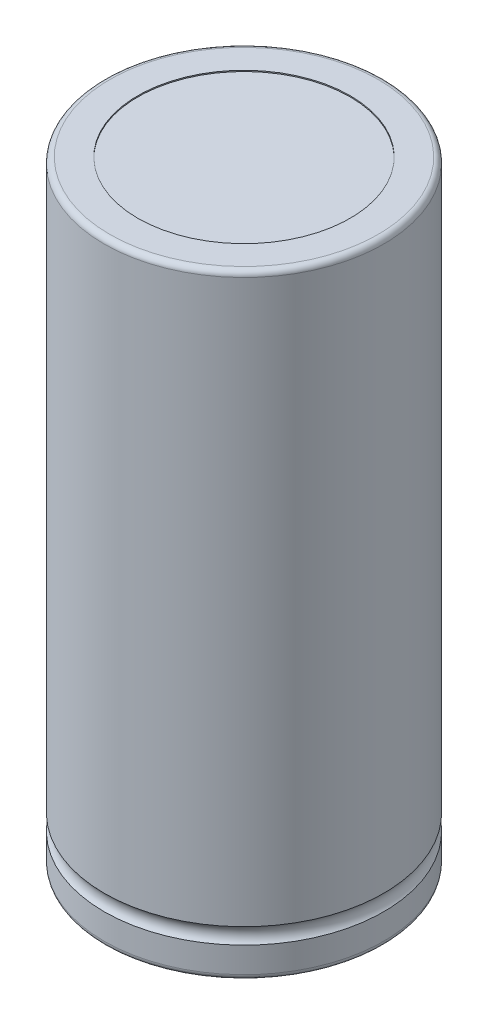
ISO-10303-21;
HEADER;
FILE_DESCRIPTION(('STEP AP214'),'2;1');
FILE_NAME('part.step','',(''),(''),'','','');
FILE_SCHEMA(('AUTOMOTIVE_DESIGN { 1 0 10303 214 1 1 1 1 }'));
ENDSEC;
DATA;
#1=APPLICATION_CONTEXT('core data for automotive mechanical design processes');
#2=APPLICATION_PROTOCOL_DEFINITION('international standard','automotive_design',2000,#1);
#3=PRODUCT_CONTEXT('',#1,'mechanical');
#4=PRODUCT('Part','Part','',(#3));
#5=PRODUCT_RELATED_PRODUCT_CATEGORY('part','',(#4));
#6=PRODUCT_DEFINITION_FORMATION('','',#4);
#7=PRODUCT_DEFINITION_CONTEXT('part definition',#1,'design');
#8=PRODUCT_DEFINITION('design','',#6,#7);
#9=PRODUCT_DEFINITION_SHAPE('','',#8);
#10=(LENGTH_UNIT() NAMED_UNIT(*) SI_UNIT(.MILLI.,.METRE.));
#11=(NAMED_UNIT(*) PLANE_ANGLE_UNIT() SI_UNIT($,.RADIAN.));
#12=(NAMED_UNIT(*) SI_UNIT($,.STERADIAN.) SOLID_ANGLE_UNIT());
#13=UNCERTAINTY_MEASURE_WITH_UNIT(LENGTH_MEASURE(1.E-05),#10,'distance_accuracy_value','');
#14=(GEOMETRIC_REPRESENTATION_CONTEXT(3) GLOBAL_UNCERTAINTY_ASSIGNED_CONTEXT((#13)) GLOBAL_UNIT_ASSIGNED_CONTEXT((#10,
#11,#12)) REPRESENTATION_CONTEXT('',''));
#15=CARTESIAN_POINT('',(0.,0.,0.));
#16=DIRECTION('',(0.,0.,1.));
#17=DIRECTION('',(1.,0.,0.));
#18=AXIS2_PLACEMENT_3D('',#15,#16,#17);
#19=CARTESIAN_POINT('',(5.,-3.9,0.));
#20=DIRECTION('',(0.,-1.,0.));
#21=DIRECTION('',(0.,0.,-1.));
#22=AXIS2_PLACEMENT_3D('',#19,#20,#21);
#23=PLANE('',#22);
#24=CARTESIAN_POINT('',(5.,-3.9,0.));
#25=DIRECTION('',(0.,1.,0.));
#26=DIRECTION('',(0.,0.,1.));
#27=AXIS2_PLACEMENT_3D('',#24,#25,#26);
#28=CIRCLE('',#27,0.4);
#29=CARTESIAN_POINT('',(5.,-3.9,0.4));
#30=VERTEX_POINT('',#29);
#31=EDGE_CURVE('E188',#30,#30,#28,.T.);
#32=ORIENTED_EDGE('',*,*,#31,.F.);
#33=EDGE_LOOP('',(#32));
#34=FACE_BOUND('',#33,.T.);
#35=ADVANCED_FACE('F17',(#34),#23,.T.);
#36=CARTESIAN_POINT('',(-5.,-3.9,0.));
#37=DIRECTION('',(0.,-1.,0.));
#38=DIRECTION('',(0.,0.,-1.));
#39=AXIS2_PLACEMENT_3D('',#36,#37,#38);
#40=PLANE('',#39);
#41=CARTESIAN_POINT('',(-5.,-3.9,0.));
#42=DIRECTION('',(0.,1.,0.));
#43=DIRECTION('',(0.,0.,1.));
#44=AXIS2_PLACEMENT_3D('',#41,#42,#43);
#45=CIRCLE('',#44,0.4);
#46=CARTESIAN_POINT('',(-5.,-3.9,0.4));
#47=VERTEX_POINT('',#46);
#48=EDGE_CURVE('E185',#47,#47,#45,.T.);
#49=ORIENTED_EDGE('',*,*,#48,.F.);
#50=EDGE_LOOP('',(#49));
#51=FACE_BOUND('',#50,.T.);
#52=ADVANCED_FACE('F203',(#51),#40,.T.);
#53=CARTESIAN_POINT('',(5.,-3.9,0.));
#54=DIRECTION('',(0.,1.,0.));
#55=DIRECTION('',(0.,0.,1.));
#56=AXIS2_PLACEMENT_3D('',#53,#54,#55);
#57=CYLINDRICAL_SURFACE('',#56,0.4);
#58=CARTESIAN_POINT('',(5.,0.0999999999999998,0.));
#59=DIRECTION('',(0.,1.,0.));
#60=DIRECTION('',(0.,0.,1.));
#61=AXIS2_PLACEMENT_3D('',#58,#59,#60);
#62=CIRCLE('',#61,0.4);
#63=CARTESIAN_POINT('',(5.,0.0999999999999998,0.4));
#64=VERTEX_POINT('',#63);
#65=EDGE_CURVE('E182',#64,#64,#62,.T.);
#66=ORIENTED_EDGE('',*,*,#65,.F.);
#67=EDGE_LOOP('',(#66));
#68=FACE_BOUND('',#67,.T.);
#69=ORIENTED_EDGE('',*,*,#31,.T.);
#70=EDGE_LOOP('',(#69));
#71=FACE_BOUND('',#70,.T.);
#72=ADVANCED_FACE('F200',(#68,#71),#57,.T.);
#73=CARTESIAN_POINT('',(-5.,-3.9,0.));
#74=DIRECTION('',(0.,1.,0.));
#75=DIRECTION('',(0.,0.,1.));
#76=AXIS2_PLACEMENT_3D('',#73,#74,#75);
#77=CYLINDRICAL_SURFACE('',#76,0.4);
#78=CARTESIAN_POINT('',(-5.,0.0999999999999998,0.));
#79=DIRECTION('',(0.,1.,0.));
#80=DIRECTION('',(0.,0.,1.));
#81=AXIS2_PLACEMENT_3D('',#78,#79,#80);
#82=CIRCLE('',#81,0.4);
#83=CARTESIAN_POINT('',(-5.,0.0999999999999998,0.4));
#84=VERTEX_POINT('',#83);
#85=EDGE_CURVE('E179',#84,#84,#82,.T.);
#86=ORIENTED_EDGE('',*,*,#85,.F.);
#87=EDGE_LOOP('',(#86));
#88=FACE_BOUND('',#87,.T.);
#89=ORIENTED_EDGE('',*,*,#48,.T.);
#90=EDGE_LOOP('',(#89));
#91=FACE_BOUND('',#90,.T.);
#92=ADVANCED_FACE('F211',(#88,#91),#77,.T.);
#93=CARTESIAN_POINT('',(-9.49999999999999,0.1,0.));
#94=DIRECTION('',(0.,-1.,0.));
#95=DIRECTION('',(0.,0.,-1.));
#96=AXIS2_PLACEMENT_3D('',#93,#94,#95);
#97=PLANE('',#96);
#98=CARTESIAN_POINT('',(0.,0.100000000000003,0.));
#99=DIRECTION('',(0.,1.,0.));
#100=DIRECTION('',(0.,0.,1.));
#101=AXIS2_PLACEMENT_3D('',#98,#99,#100);
#102=CIRCLE('',#101,9.49999999999999);
#103=CARTESIAN_POINT('',(0.,0.100000000000003,9.49999999999999));
#104=VERTEX_POINT('',#103);
#105=EDGE_CURVE('E176',#104,#104,#102,.F.);
#106=ORIENTED_EDGE('',*,*,#105,.T.);
#107=EDGE_LOOP('',(#106));
#108=FACE_BOUND('',#107,.T.);
#109=ORIENTED_EDGE('',*,*,#85,.T.);
#110=EDGE_LOOP('',(#109));
#111=FACE_BOUND('',#110,.T.);
#112=ORIENTED_EDGE('',*,*,#65,.T.);
#113=EDGE_LOOP('',(#112));
#114=FACE_BOUND('',#113,.T.);
#115=ADVANCED_FACE('F218',(#108,#111,#114),#97,.T.);
#116=CARTESIAN_POINT('',(0.,42.5565122190237,0.));
#117=DIRECTION('',(0.,1.,0.));
#118=DIRECTION('',(0.,0.,1.));
#119=AXIS2_PLACEMENT_3D('',#116,#117,#118);
#120=CYLINDRICAL_SURFACE('',#119,9.49999999999999);
#121=ORIENTED_EDGE('',*,*,#105,.F.);
#122=EDGE_LOOP('',(#121));
#123=FACE_BOUND('',#122,.T.);
#124=CARTESIAN_POINT('',(0.,0.,0.));
#125=DIRECTION('',(0.,1.,0.));
#126=DIRECTION('',(0.,0.,1.));
#127=AXIS2_PLACEMENT_3D('',#124,#125,#126);
#128=CIRCLE('',#127,9.49999999999999);
#129=CARTESIAN_POINT('',(0.,0.,9.49999999999999));
#130=VERTEX_POINT('',#129);
#131=EDGE_CURVE('E53',#130,#130,#128,.T.);
#132=ORIENTED_EDGE('',*,*,#131,.F.);
#133=EDGE_LOOP('',(#132));
#134=FACE_BOUND('',#133,.T.);
#135=ADVANCED_FACE('F221',(#123,#134),#120,.F.);
#136=CARTESIAN_POINT('',(-9.49999999999999,0.,0.));
#137=DIRECTION('',(0.,-1.,0.));
#138=DIRECTION('',(0.,0.,-1.));
#139=AXIS2_PLACEMENT_3D('',#136,#137,#138);
#140=PLANE('',#139);
#141=CARTESIAN_POINT('',(0.,0.,0.));
#142=DIRECTION('',(0.,1.,0.));
#143=DIRECTION('',(0.,0.,1.));
#144=AXIS2_PLACEMENT_3D('',#141,#142,#143);
#145=CIRCLE('',#144,12.);
#146=CARTESIAN_POINT('',(0.,0.,12.));
#147=VERTEX_POINT('',#146);
#148=CARTESIAN_POINT('',(0.,0.,-12.));
#149=VERTEX_POINT('',#148);
#150=EDGE_CURVE('E45',#147,#149,#145,.T.);
#151=ORIENTED_EDGE('',*,*,#150,.F.);
#152=CARTESIAN_POINT('',(0.,0.,0.));
#153=DIRECTION('',(0.,1.,0.));
#154=DIRECTION('',(0.,0.,-1.));
#155=AXIS2_PLACEMENT_3D('',#152,#153,#154);
#156=CIRCLE('',#155,12.);
#157=EDGE_CURVE('E48',#149,#147,#156,.T.);
#158=ORIENTED_EDGE('',*,*,#157,.F.);
#159=EDGE_LOOP('',(#151,#158));
#160=FACE_BOUND('',#159,.T.);
#161=ORIENTED_EDGE('',*,*,#131,.T.);
#162=EDGE_LOOP('',(#161));
#163=FACE_BOUND('',#162,.T.);
#164=ADVANCED_FACE('F50',(#160,#163),#140,.T.);
#165=CARTESIAN_POINT('',(0.,0.5,0.));
#166=DIRECTION('',(0.,1.,0.));
#167=DIRECTION('',(0.,0.,1.));
#168=AXIS2_PLACEMENT_3D('',#165,#166,#167);
#169=TOROIDAL_SURFACE('',#168,12.,0.5);
#170=CARTESIAN_POINT('',(0.,0.5,0.));
#171=DIRECTION('',(0.,1.,0.));
#172=DIRECTION('',(0.,0.,1.));
#173=AXIS2_PLACEMENT_3D('',#170,#171,#172);
#174=CIRCLE('',#173,12.5);
#175=CARTESIAN_POINT('',(0.,0.5,12.5));
#176=VERTEX_POINT('',#175);
#177=EDGE_CURVE('E58',#176,#176,#174,.T.);
#178=ORIENTED_EDGE('',*,*,#177,.F.);
#179=EDGE_LOOP('',(#178));
#180=FACE_BOUND('',#179,.T.);
#181=ORIENTED_EDGE('',*,*,#150,.T.);
#182=ORIENTED_EDGE('',*,*,#157,.T.);
#183=EDGE_LOOP('',(#181,#182));
#184=FACE_BOUND('',#183,.T.);
#185=ADVANCED_FACE('F57',(#180,#184),#169,.T.);
#186=CARTESIAN_POINT('',(-9.5,54.9,0.));
#187=DIRECTION('',(0.,1.,0.));
#188=DIRECTION('',(0.,0.,1.));
#189=AXIS2_PLACEMENT_3D('',#186,#187,#188);
#190=PLANE('',#189);
#191=CARTESIAN_POINT('',(0.,54.9,0.));
#192=DIRECTION('',(0.,1.,0.));
#193=DIRECTION('',(0.,0.,1.));
#194=AXIS2_PLACEMENT_3D('',#191,#192,#193);
#195=CIRCLE('',#194,9.5);
#196=CARTESIAN_POINT('',(0.,54.9,9.5));
#197=VERTEX_POINT('',#196);
#198=EDGE_CURVE('E94',#197,#197,#195,.T.);
#199=ORIENTED_EDGE('',*,*,#198,.T.);
#200=EDGE_LOOP('',(#199));
#201=FACE_BOUND('',#200,.T.);
#202=ADVANCED_FACE('F77',(#201),#190,.T.);
#203=CARTESIAN_POINT('',(0.,42.5565122190237,0.));
#204=DIRECTION('',(0.,1.,0.));
#205=DIRECTION('',(0.,0.,1.));
#206=AXIS2_PLACEMENT_3D('',#203,#204,#205);
#207=CYLINDRICAL_SURFACE('',#206,12.5);
#208=CARTESIAN_POINT('',(0.,2.78585715714572,0.));
#209=DIRECTION('',(0.,1.,0.));
#210=DIRECTION('',(0.,0.,1.));
#211=AXIS2_PLACEMENT_3D('',#208,#209,#210);
#212=CIRCLE('',#211,12.5);
#213=CARTESIAN_POINT('',(0.,2.78585715714572,12.5));
#214=VERTEX_POINT('',#213);
#215=EDGE_CURVE('E95',#214,#214,#212,.F.);
#216=ORIENTED_EDGE('',*,*,#215,.T.);
#217=EDGE_LOOP('',(#216));
#218=FACE_BOUND('',#217,.T.);
#219=ORIENTED_EDGE('',*,*,#177,.T.);
#220=EDGE_LOOP('',(#219));
#221=FACE_BOUND('',#220,.T.);
#222=ADVANCED_FACE('F148',(#218,#221),#207,.T.);
#223=CARTESIAN_POINT('',(0.,42.5565122190237,0.));
#224=DIRECTION('',(0.,1.,0.));
#225=DIRECTION('',(0.,0.,1.));
#226=AXIS2_PLACEMENT_3D('',#223,#224,#225);
#227=CYLINDRICAL_SURFACE('',#226,9.5);
#228=CARTESIAN_POINT('',(0.,55.,0.));
#229=DIRECTION('',(0.,1.,0.));
#230=DIRECTION('',(0.,0.,1.));
#231=AXIS2_PLACEMENT_3D('',#228,#229,#230);
#232=CIRCLE('',#231,9.5);
#233=CARTESIAN_POINT('',(0.,55.,9.5));
#234=VERTEX_POINT('',#233);
#235=EDGE_CURVE('E66',#234,#234,#232,.F.);
#236=ORIENTED_EDGE('',*,*,#235,.F.);
#237=EDGE_LOOP('',(#236));
#238=FACE_BOUND('',#237,.T.);
#239=ORIENTED_EDGE('',*,*,#198,.F.);
#240=EDGE_LOOP('',(#239));
#241=FACE_BOUND('',#240,.T.);
#242=ADVANCED_FACE('F137',(#238,#241),#227,.F.);
#243=CARTESIAN_POINT('',(-12.,55.,0.));
#244=DIRECTION('',(0.,1.,0.));
#245=DIRECTION('',(0.,0.,1.));
#246=AXIS2_PLACEMENT_3D('',#243,#244,#245);
#247=PLANE('',#246);
#248=ORIENTED_EDGE('',*,*,#235,.T.);
#249=EDGE_LOOP('',(#248));
#250=FACE_BOUND('',#249,.T.);
#251=CARTESIAN_POINT('',(0.,55.,0.));
#252=DIRECTION('',(0.,-1.,0.));
#253=DIRECTION('',(0.,0.,-1.));
#254=AXIS2_PLACEMENT_3D('',#251,#252,#253);
#255=CIRCLE('',#254,12.);
#256=CARTESIAN_POINT('',(0.,55.,-12.));
#257=VERTEX_POINT('',#256);
#258=CARTESIAN_POINT('',(0.,55.,12.));
#259=VERTEX_POINT('',#258);
#260=EDGE_CURVE('E125',#257,#259,#255,.T.);
#261=ORIENTED_EDGE('',*,*,#260,.F.);
#262=CARTESIAN_POINT('',(0.,55.,0.));
#263=DIRECTION('',(0.,-1.,0.));
#264=DIRECTION('',(0.,0.,1.));
#265=AXIS2_PLACEMENT_3D('',#262,#263,#264);
#266=CIRCLE('',#265,12.);
#267=EDGE_CURVE('E36',#259,#257,#266,.T.);
#268=ORIENTED_EDGE('',*,*,#267,.F.);
#269=EDGE_LOOP('',(#261,#268));
#270=FACE_BOUND('',#269,.T.);
#271=ADVANCED_FACE('F128',(#250,#270),#247,.T.);
#272=CARTESIAN_POINT('',(0.,3.5,0.));
#273=DIRECTION('',(0.,1.,0.));
#274=DIRECTION('',(0.,0.,1.));
#275=AXIS2_PLACEMENT_3D('',#272,#273,#274);
#276=TOROIDAL_SURFACE('',#275,13.2,1.);
#277=ORIENTED_EDGE('',*,*,#215,.F.);
#278=EDGE_LOOP('',(#277));
#279=FACE_BOUND('',#278,.T.);
#280=CARTESIAN_POINT('',(0.,4.21414284285428,0.));
#281=DIRECTION('',(0.,1.,0.));
#282=DIRECTION('',(0.,0.,1.));
#283=AXIS2_PLACEMENT_3D('',#280,#281,#282);
#284=CIRCLE('',#283,12.5);
#285=CARTESIAN_POINT('',(0.,4.21414284285428,12.5));
#286=VERTEX_POINT('',#285);
#287=EDGE_CURVE('E28',#286,#286,#284,.T.);
#288=ORIENTED_EDGE('',*,*,#287,.F.);
#289=EDGE_LOOP('',(#288));
#290=FACE_BOUND('',#289,.T.);
#291=ADVANCED_FACE('F115',(#279,#290),#276,.F.);
#292=CARTESIAN_POINT('',(0.,54.5,0.));
#293=DIRECTION('',(0.,1.,0.));
#294=DIRECTION('',(0.,0.,1.));
#295=AXIS2_PLACEMENT_3D('',#292,#293,#294);
#296=TOROIDAL_SURFACE('',#295,12.,0.5);
#297=ORIENTED_EDGE('',*,*,#267,.T.);
#298=ORIENTED_EDGE('',*,*,#260,.T.);
#299=EDGE_LOOP('',(#297,#298));
#300=FACE_BOUND('',#299,.T.);
#301=CARTESIAN_POINT('',(0.,54.5,0.));
#302=DIRECTION('',(0.,1.,0.));
#303=DIRECTION('',(0.,0.,1.));
#304=AXIS2_PLACEMENT_3D('',#301,#302,#303);
#305=CIRCLE('',#304,12.5);
#306=CARTESIAN_POINT('',(0.,54.5,12.5));
#307=VERTEX_POINT('',#306);
#308=EDGE_CURVE('E11',#307,#307,#305,.F.);
#309=ORIENTED_EDGE('',*,*,#308,.F.);
#310=EDGE_LOOP('',(#309));
#311=FACE_BOUND('',#310,.T.);
#312=ADVANCED_FACE('F103',(#300,#311),#296,.T.);
#313=CARTESIAN_POINT('',(0.,42.5565122190237,0.));
#314=DIRECTION('',(0.,1.,0.));
#315=DIRECTION('',(0.,0.,1.));
#316=AXIS2_PLACEMENT_3D('',#313,#314,#315);
#317=CYLINDRICAL_SURFACE('',#316,12.5);
#318=ORIENTED_EDGE('',*,*,#308,.T.);
#319=EDGE_LOOP('',(#318));
#320=FACE_BOUND('',#319,.T.);
#321=ORIENTED_EDGE('',*,*,#287,.T.);
#322=EDGE_LOOP('',(#321));
#323=FACE_BOUND('',#322,.T.);
#324=ADVANCED_FACE('F114',(#320,#323),#317,.T.);
#325=CLOSED_SHELL('',(#35,#52,#72,#92,#115,#135,#164,#185,#202,#222,#242,#271,#291,#312,#324));
#326=MANIFOLD_SOLID_BREP('B1',#325);
#327=ADVANCED_BREP_SHAPE_REPRESENTATION('',(#18,#326),#14);
#328=SHAPE_DEFINITION_REPRESENTATION(#9,#327);
ENDSEC;
END-ISO-10303-21;
